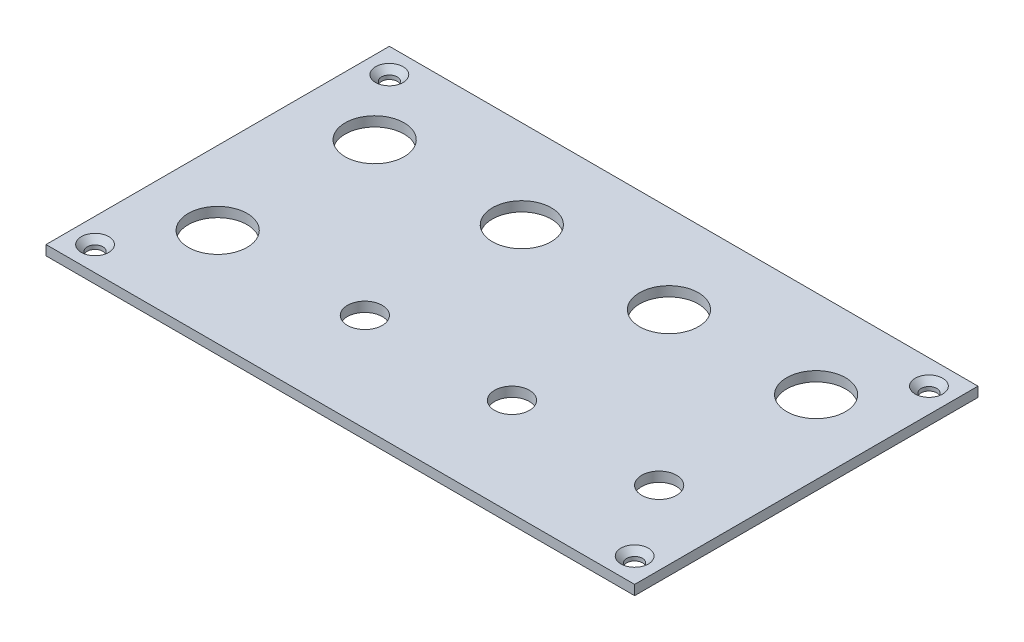
ISO-10303-21;
HEADER;
FILE_DESCRIPTION(('STEP AP214'),'2;1');
FILE_NAME('part.step','',(''),(''),'','','');
FILE_SCHEMA(('AUTOMOTIVE_DESIGN { 1 0 10303 214 1 1 1 1 }'));
ENDSEC;
DATA;
#1=APPLICATION_CONTEXT('core data for automotive mechanical design processes');
#2=APPLICATION_PROTOCOL_DEFINITION('international standard','automotive_design',2000,#1);
#3=PRODUCT_CONTEXT('',#1,'mechanical');
#4=PRODUCT('Part','Part','',(#3));
#5=PRODUCT_RELATED_PRODUCT_CATEGORY('part','',(#4));
#6=PRODUCT_DEFINITION_FORMATION('','',#4);
#7=PRODUCT_DEFINITION_CONTEXT('part definition',#1,'design');
#8=PRODUCT_DEFINITION('design','',#6,#7);
#9=PRODUCT_DEFINITION_SHAPE('','',#8);
#10=(LENGTH_UNIT() NAMED_UNIT(*) SI_UNIT(.MILLI.,.METRE.));
#11=(NAMED_UNIT(*) PLANE_ANGLE_UNIT() SI_UNIT($,.RADIAN.));
#12=(NAMED_UNIT(*) SI_UNIT($,.STERADIAN.) SOLID_ANGLE_UNIT());
#13=UNCERTAINTY_MEASURE_WITH_UNIT(LENGTH_MEASURE(1.E-05),#10,'distance_accuracy_value','');
#14=(GEOMETRIC_REPRESENTATION_CONTEXT(3) GLOBAL_UNCERTAINTY_ASSIGNED_CONTEXT((#13)) GLOBAL_UNIT_ASSIGNED_CONTEXT((#10,
#11,#12)) REPRESENTATION_CONTEXT('',''));
#15=CARTESIAN_POINT('',(0.,0.,0.));
#16=DIRECTION('',(0.,0.,1.));
#17=DIRECTION('',(1.,0.,0.));
#18=AXIS2_PLACEMENT_3D('',#15,#16,#17);
#19=CARTESIAN_POINT('',(0.,2.,0.));
#20=DIRECTION('',(-1.,0.,0.));
#21=DIRECTION('',(0.,0.,1.));
#22=AXIS2_PLACEMENT_3D('',#19,#20,#21);
#23=PLANE('',#22);
#24=DIRECTION('',(0.,0.,-1.));
#25=VECTOR('',#24,1.);
#26=CARTESIAN_POINT('',(0.,0.,0.));
#27=LINE('',#26,#25);
#28=CARTESIAN_POINT('',(0.,0.,0.));
#29=VERTEX_POINT('',#28);
#30=CARTESIAN_POINT('',(0.,0.,-70.));
#31=VERTEX_POINT('',#30);
#32=EDGE_CURVE('E99',#29,#31,#27,.T.);
#33=ORIENTED_EDGE('',*,*,#32,.T.);
#34=DIRECTION('',(0.,-1.,0.));
#35=VECTOR('',#34,1.);
#36=CARTESIAN_POINT('',(0.,2.,-70.));
#37=LINE('',#36,#35);
#38=CARTESIAN_POINT('',(0.,2.,-70.));
#39=VERTEX_POINT('',#38);
#40=EDGE_CURVE('E11',#39,#31,#37,.T.);
#41=ORIENTED_EDGE('',*,*,#40,.F.);
#42=DIRECTION('',(0.,0.,-1.));
#43=VECTOR('',#42,1.);
#44=CARTESIAN_POINT('',(0.,2.,0.));
#45=LINE('',#44,#43);
#46=CARTESIAN_POINT('',(0.,2.,0.));
#47=VERTEX_POINT('',#46);
#48=EDGE_CURVE('E86',#47,#39,#45,.T.);
#49=ORIENTED_EDGE('',*,*,#48,.F.);
#50=DIRECTION('',(0.,-1.,0.));
#51=VECTOR('',#50,1.);
#52=CARTESIAN_POINT('',(0.,2.,0.));
#53=LINE('',#52,#51);
#54=EDGE_CURVE('E95',#47,#29,#53,.T.);
#55=ORIENTED_EDGE('',*,*,#54,.T.);
#56=EDGE_LOOP('',(#33,#41,#49,#55));
#57=FACE_BOUND('',#56,.T.);
#58=ADVANCED_FACE('F33',(#57),#23,.F.);
#59=CARTESIAN_POINT('',(0.,2.,-70.));
#60=DIRECTION('',(0.,0.,1.));
#61=DIRECTION('',(1.,0.,0.));
#62=AXIS2_PLACEMENT_3D('',#59,#60,#61);
#63=PLANE('',#62);
#64=DIRECTION('',(-1.,0.,0.));
#65=VECTOR('',#64,1.);
#66=CARTESIAN_POINT('',(0.,0.,-70.));
#67=LINE('',#66,#65);
#68=CARTESIAN_POINT('',(-120.,0.,-70.));
#69=VERTEX_POINT('',#68);
#70=EDGE_CURVE('E90',#31,#69,#67,.T.);
#71=ORIENTED_EDGE('',*,*,#70,.T.);
#72=DIRECTION('',(0.,-1.,0.));
#73=VECTOR('',#72,1.);
#74=CARTESIAN_POINT('',(-120.,2.,-70.));
#75=LINE('',#74,#73);
#76=CARTESIAN_POINT('',(-120.,2.,-70.));
#77=VERTEX_POINT('',#76);
#78=EDGE_CURVE('E42',#77,#69,#75,.T.);
#79=ORIENTED_EDGE('',*,*,#78,.F.);
#80=DIRECTION('',(-1.,0.,0.));
#81=VECTOR('',#80,1.);
#82=CARTESIAN_POINT('',(0.,2.,-70.));
#83=LINE('',#82,#81);
#84=EDGE_CURVE('E81',#39,#77,#83,.T.);
#85=ORIENTED_EDGE('',*,*,#84,.F.);
#86=ORIENTED_EDGE('',*,*,#40,.T.);
#87=EDGE_LOOP('',(#71,#79,#85,#86));
#88=FACE_BOUND('',#87,.T.);
#89=ADVANCED_FACE('F89',(#88),#63,.F.);
#90=CARTESIAN_POINT('',(-120.,2.,0.));
#91=DIRECTION('',(1.,0.,0.));
#92=DIRECTION('',(0.,0.,-1.));
#93=AXIS2_PLACEMENT_3D('',#90,#91,#92);
#94=PLANE('',#93);
#95=DIRECTION('',(0.,0.,1.));
#96=VECTOR('',#95,1.);
#97=CARTESIAN_POINT('',(-120.,0.,0.));
#98=LINE('',#97,#96);
#99=CARTESIAN_POINT('',(-120.,0.,0.));
#100=VERTEX_POINT('',#99);
#101=EDGE_CURVE('E68',#69,#100,#98,.T.);
#102=ORIENTED_EDGE('',*,*,#101,.T.);
#103=DIRECTION('',(0.,-1.,0.));
#104=VECTOR('',#103,1.);
#105=CARTESIAN_POINT('',(-120.,2.,0.));
#106=LINE('',#105,#104);
#107=CARTESIAN_POINT('',(-120.,2.,0.));
#108=VERTEX_POINT('',#107);
#109=EDGE_CURVE('E91',#108,#100,#106,.T.);
#110=ORIENTED_EDGE('',*,*,#109,.F.);
#111=DIRECTION('',(0.,0.,1.));
#112=VECTOR('',#111,1.);
#113=CARTESIAN_POINT('',(-120.,2.,0.));
#114=LINE('',#113,#112);
#115=EDGE_CURVE('E84',#77,#108,#114,.T.);
#116=ORIENTED_EDGE('',*,*,#115,.F.);
#117=ORIENTED_EDGE('',*,*,#78,.T.);
#118=EDGE_LOOP('',(#102,#110,#116,#117));
#119=FACE_BOUND('',#118,.T.);
#120=ADVANCED_FACE('F93',(#119),#94,.F.);
#121=CARTESIAN_POINT('',(0.,2.,0.));
#122=DIRECTION('',(0.,0.,-1.));
#123=DIRECTION('',(-1.,0.,0.));
#124=AXIS2_PLACEMENT_3D('',#121,#122,#123);
#125=PLANE('',#124);
#126=DIRECTION('',(1.,0.,0.));
#127=VECTOR('',#126,1.);
#128=CARTESIAN_POINT('',(0.,0.,0.));
#129=LINE('',#128,#127);
#130=EDGE_CURVE('E74',#100,#29,#129,.T.);
#131=ORIENTED_EDGE('',*,*,#130,.T.);
#132=ORIENTED_EDGE('',*,*,#54,.F.);
#133=DIRECTION('',(1.,0.,0.));
#134=VECTOR('',#133,1.);
#135=CARTESIAN_POINT('',(0.,2.,0.));
#136=LINE('',#135,#134);
#137=EDGE_CURVE('E51',#108,#47,#136,.T.);
#138=ORIENTED_EDGE('',*,*,#137,.F.);
#139=ORIENTED_EDGE('',*,*,#109,.T.);
#140=EDGE_LOOP('',(#131,#132,#138,#139));
#141=FACE_BOUND('',#140,.T.);
#142=ADVANCED_FACE('F196',(#141),#125,.F.);
#143=CARTESIAN_POINT('',(0.,2.,0.));
#144=DIRECTION('',(0.,1.,0.));
#145=DIRECTION('',(0.,0.,1.));
#146=AXIS2_PLACEMENT_3D('',#143,#144,#145);
#147=PLANE('',#146);
#148=CARTESIAN_POINT('',(-115.,2.,-4.99999999999999));
#149=DIRECTION('',(0.,1.,0.));
#150=DIRECTION('',(0.,0.,1.));
#151=AXIS2_PLACEMENT_3D('',#148,#149,#150);
#152=CIRCLE('',#151,2.79999999999999);
#153=CARTESIAN_POINT('',(-115.,2.,-2.2));
#154=VERTEX_POINT('',#153);
#155=EDGE_CURVE('E128',#154,#154,#152,.T.);
#156=ORIENTED_EDGE('',*,*,#155,.F.);
#157=EDGE_LOOP('',(#156));
#158=FACE_BOUND('',#157,.T.);
#159=CARTESIAN_POINT('',(-5.,2.,-4.99999999999999));
#160=DIRECTION('',(0.,1.,0.));
#161=DIRECTION('',(0.,0.,1.));
#162=AXIS2_PLACEMENT_3D('',#159,#160,#161);
#163=CIRCLE('',#162,2.8);
#164=CARTESIAN_POINT('',(-5.,2.,-2.19999999999999));
#165=VERTEX_POINT('',#164);
#166=EDGE_CURVE('E118',#165,#165,#163,.T.);
#167=ORIENTED_EDGE('',*,*,#166,.F.);
#168=EDGE_LOOP('',(#167));
#169=FACE_BOUND('',#168,.T.);
#170=CARTESIAN_POINT('',(-5.,2.,-65.));
#171=DIRECTION('',(0.,1.,0.));
#172=DIRECTION('',(0.,0.,1.));
#173=AXIS2_PLACEMENT_3D('',#170,#171,#172);
#174=CIRCLE('',#173,2.8);
#175=CARTESIAN_POINT('',(-5.,2.,-62.2));
#176=VERTEX_POINT('',#175);
#177=EDGE_CURVE('E115',#176,#176,#174,.T.);
#178=ORIENTED_EDGE('',*,*,#177,.F.);
#179=EDGE_LOOP('',(#178));
#180=FACE_BOUND('',#179,.T.);
#181=CARTESIAN_POINT('',(-115.,2.,-65.));
#182=DIRECTION('',(0.,1.,0.));
#183=DIRECTION('',(0.,0.,1.));
#184=AXIS2_PLACEMENT_3D('',#181,#182,#183);
#185=CIRCLE('',#184,2.79999999999999);
#186=CARTESIAN_POINT('',(-115.,2.,-62.2));
#187=VERTEX_POINT('',#186);
#188=EDGE_CURVE('E112',#187,#187,#185,.T.);
#189=ORIENTED_EDGE('',*,*,#188,.F.);
#190=EDGE_LOOP('',(#189));
#191=FACE_BOUND('',#190,.T.);
#192=CARTESIAN_POINT('',(-105.,2.,-20.));
#193=DIRECTION('',(0.,1.,0.));
#194=DIRECTION('',(0.,0.,1.));
#195=AXIS2_PLACEMENT_3D('',#192,#193,#194);
#196=CIRCLE('',#195,6.);
#197=CARTESIAN_POINT('',(-105.,2.,-14.));
#198=VERTEX_POINT('',#197);
#199=EDGE_CURVE('E144',#198,#198,#196,.T.);
#200=ORIENTED_EDGE('',*,*,#199,.F.);
#201=EDGE_LOOP('',(#200));
#202=FACE_BOUND('',#201,.T.);
#203=CARTESIAN_POINT('',(-15.,2.,-20.));
#204=DIRECTION('',(0.,1.,0.));
#205=DIRECTION('',(0.,0.,1.));
#206=AXIS2_PLACEMENT_3D('',#203,#204,#205);
#207=CIRCLE('',#206,3.55);
#208=CARTESIAN_POINT('',(-15.,2.,-16.45));
#209=VERTEX_POINT('',#208);
#210=EDGE_CURVE('E148',#209,#209,#207,.T.);
#211=ORIENTED_EDGE('',*,*,#210,.F.);
#212=EDGE_LOOP('',(#211));
#213=FACE_BOUND('',#212,.T.);
#214=CARTESIAN_POINT('',(-45.,2.,-20.));
#215=DIRECTION('',(0.,1.,0.));
#216=DIRECTION('',(0.,0.,1.));
#217=AXIS2_PLACEMENT_3D('',#214,#215,#216);
#218=CIRCLE('',#217,3.55);
#219=CARTESIAN_POINT('',(-45.,2.,-16.45));
#220=VERTEX_POINT('',#219);
#221=EDGE_CURVE('E154',#220,#220,#218,.T.);
#222=ORIENTED_EDGE('',*,*,#221,.F.);
#223=EDGE_LOOP('',(#222));
#224=FACE_BOUND('',#223,.T.);
#225=CARTESIAN_POINT('',(-75.,2.,-20.));
#226=DIRECTION('',(0.,1.,0.));
#227=DIRECTION('',(0.,0.,1.));
#228=AXIS2_PLACEMENT_3D('',#225,#226,#227);
#229=CIRCLE('',#228,3.55);
#230=CARTESIAN_POINT('',(-75.,2.,-16.45));
#231=VERTEX_POINT('',#230);
#232=EDGE_CURVE('E160',#231,#231,#229,.T.);
#233=ORIENTED_EDGE('',*,*,#232,.F.);
#234=EDGE_LOOP('',(#233));
#235=FACE_BOUND('',#234,.T.);
#236=CARTESIAN_POINT('',(-15.,2.,-52.));
#237=DIRECTION('',(0.,1.,0.));
#238=DIRECTION('',(0.,0.,1.));
#239=AXIS2_PLACEMENT_3D('',#236,#237,#238);
#240=CIRCLE('',#239,6.00000000000001);
#241=CARTESIAN_POINT('',(-15.,2.,-46.));
#242=VERTEX_POINT('',#241);
#243=EDGE_CURVE('E166',#242,#242,#240,.T.);
#244=ORIENTED_EDGE('',*,*,#243,.F.);
#245=EDGE_LOOP('',(#244));
#246=FACE_BOUND('',#245,.T.);
#247=CARTESIAN_POINT('',(-45.,2.,-52.));
#248=DIRECTION('',(0.,1.,0.));
#249=DIRECTION('',(0.,0.,1.));
#250=AXIS2_PLACEMENT_3D('',#247,#248,#249);
#251=CIRCLE('',#250,6.);
#252=CARTESIAN_POINT('',(-45.,2.,-46.));
#253=VERTEX_POINT('',#252);
#254=EDGE_CURVE('E172',#253,#253,#251,.T.);
#255=ORIENTED_EDGE('',*,*,#254,.F.);
#256=EDGE_LOOP('',(#255));
#257=FACE_BOUND('',#256,.T.);
#258=CARTESIAN_POINT('',(-75.,2.,-52.));
#259=DIRECTION('',(0.,1.,0.));
#260=DIRECTION('',(0.,0.,1.));
#261=AXIS2_PLACEMENT_3D('',#258,#259,#260);
#262=CIRCLE('',#261,6.);
#263=CARTESIAN_POINT('',(-75.,2.,-46.));
#264=VERTEX_POINT('',#263);
#265=EDGE_CURVE('E178',#264,#264,#262,.T.);
#266=ORIENTED_EDGE('',*,*,#265,.F.);
#267=EDGE_LOOP('',(#266));
#268=FACE_BOUND('',#267,.T.);
#269=CARTESIAN_POINT('',(-105.,2.,-52.));
#270=DIRECTION('',(0.,1.,0.));
#271=DIRECTION('',(0.,0.,1.));
#272=AXIS2_PLACEMENT_3D('',#269,#270,#271);
#273=CIRCLE('',#272,6.);
#274=CARTESIAN_POINT('',(-105.,2.,-46.));
#275=VERTEX_POINT('',#274);
#276=EDGE_CURVE('E184',#275,#275,#273,.T.);
#277=ORIENTED_EDGE('',*,*,#276,.F.);
#278=EDGE_LOOP('',(#277));
#279=FACE_BOUND('',#278,.T.);
#280=ORIENTED_EDGE('',*,*,#48,.T.);
#281=ORIENTED_EDGE('',*,*,#84,.T.);
#282=ORIENTED_EDGE('',*,*,#115,.T.);
#283=ORIENTED_EDGE('',*,*,#137,.T.);
#284=EDGE_LOOP('',(#280,#281,#282,#283));
#285=FACE_BOUND('',#284,.T.);
#286=ADVANCED_FACE('F82',(#158,#169,#180,#191,#202,#213,#224,#235,#246,#257,#268,#279,#285),
#147,.T.);
#287=CARTESIAN_POINT('',(0.,0.,0.));
#288=DIRECTION('',(0.,1.,0.));
#289=DIRECTION('',(0.,0.,1.));
#290=AXIS2_PLACEMENT_3D('',#287,#288,#289);
#291=PLANE('',#290);
#292=CARTESIAN_POINT('',(-115.,0.,-4.99999999999999));
#293=DIRECTION('',(0.,1.,0.));
#294=DIRECTION('',(0.,0.,1.));
#295=AXIS2_PLACEMENT_3D('',#292,#293,#294);
#296=CIRCLE('',#295,1.60000000000001);
#297=CARTESIAN_POINT('',(-115.,0.,-3.39999999999998));
#298=VERTEX_POINT('',#297);
#299=EDGE_CURVE('E111',#298,#298,#296,.T.);
#300=ORIENTED_EDGE('',*,*,#299,.T.);
#301=EDGE_LOOP('',(#300));
#302=FACE_BOUND('',#301,.T.);
#303=CARTESIAN_POINT('',(-5.,0.,-4.99999999999999));
#304=DIRECTION('',(0.,1.,0.));
#305=DIRECTION('',(0.,0.,1.));
#306=AXIS2_PLACEMENT_3D('',#303,#304,#305);
#307=CIRCLE('',#306,1.6);
#308=CARTESIAN_POINT('',(-5.,0.,-3.39999999999999));
#309=VERTEX_POINT('',#308);
#310=EDGE_CURVE('E135',#309,#309,#307,.T.);
#311=ORIENTED_EDGE('',*,*,#310,.T.);
#312=EDGE_LOOP('',(#311));
#313=FACE_BOUND('',#312,.T.);
#314=CARTESIAN_POINT('',(-5.,0.,-65.));
#315=DIRECTION('',(0.,1.,0.));
#316=DIRECTION('',(0.,0.,1.));
#317=AXIS2_PLACEMENT_3D('',#314,#315,#316);
#318=CIRCLE('',#317,1.60000000000001);
#319=CARTESIAN_POINT('',(-5.,0.,-63.4));
#320=VERTEX_POINT('',#319);
#321=EDGE_CURVE('E138',#320,#320,#318,.T.);
#322=ORIENTED_EDGE('',*,*,#321,.T.);
#323=EDGE_LOOP('',(#322));
#324=FACE_BOUND('',#323,.T.);
#325=CARTESIAN_POINT('',(-115.,0.,-65.));
#326=DIRECTION('',(0.,1.,0.));
#327=DIRECTION('',(0.,0.,1.));
#328=AXIS2_PLACEMENT_3D('',#325,#326,#327);
#329=CIRCLE('',#328,1.60000000000001);
#330=CARTESIAN_POINT('',(-115.,0.,-63.4));
#331=VERTEX_POINT('',#330);
#332=EDGE_CURVE('E141',#331,#331,#329,.T.);
#333=ORIENTED_EDGE('',*,*,#332,.T.);
#334=EDGE_LOOP('',(#333));
#335=FACE_BOUND('',#334,.T.);
#336=CARTESIAN_POINT('',(-105.,0.,-20.));
#337=DIRECTION('',(0.,1.,0.));
#338=DIRECTION('',(0.,0.,1.));
#339=AXIS2_PLACEMENT_3D('',#336,#337,#338);
#340=CIRCLE('',#339,6.);
#341=CARTESIAN_POINT('',(-105.,0.,-14.));
#342=VERTEX_POINT('',#341);
#343=EDGE_CURVE('E145',#342,#342,#340,.T.);
#344=ORIENTED_EDGE('',*,*,#343,.T.);
#345=EDGE_LOOP('',(#344));
#346=FACE_BOUND('',#345,.T.);
#347=CARTESIAN_POINT('',(-15.,0.,-20.));
#348=DIRECTION('',(0.,1.,0.));
#349=DIRECTION('',(0.,0.,1.));
#350=AXIS2_PLACEMENT_3D('',#347,#348,#349);
#351=CIRCLE('',#350,3.55);
#352=CARTESIAN_POINT('',(-15.,0.,-16.45));
#353=VERTEX_POINT('',#352);
#354=EDGE_CURVE('E151',#353,#353,#351,.T.);
#355=ORIENTED_EDGE('',*,*,#354,.T.);
#356=EDGE_LOOP('',(#355));
#357=FACE_BOUND('',#356,.T.);
#358=CARTESIAN_POINT('',(-45.,0.,-20.));
#359=DIRECTION('',(0.,1.,0.));
#360=DIRECTION('',(0.,0.,1.));
#361=AXIS2_PLACEMENT_3D('',#358,#359,#360);
#362=CIRCLE('',#361,3.55);
#363=CARTESIAN_POINT('',(-45.,0.,-16.45));
#364=VERTEX_POINT('',#363);
#365=EDGE_CURVE('E157',#364,#364,#362,.T.);
#366=ORIENTED_EDGE('',*,*,#365,.T.);
#367=EDGE_LOOP('',(#366));
#368=FACE_BOUND('',#367,.T.);
#369=CARTESIAN_POINT('',(-75.,0.,-20.));
#370=DIRECTION('',(0.,1.,0.));
#371=DIRECTION('',(0.,0.,1.));
#372=AXIS2_PLACEMENT_3D('',#369,#370,#371);
#373=CIRCLE('',#372,3.55);
#374=CARTESIAN_POINT('',(-75.,0.,-16.45));
#375=VERTEX_POINT('',#374);
#376=EDGE_CURVE('E163',#375,#375,#373,.T.);
#377=ORIENTED_EDGE('',*,*,#376,.T.);
#378=EDGE_LOOP('',(#377));
#379=FACE_BOUND('',#378,.T.);
#380=CARTESIAN_POINT('',(-15.,0.,-52.));
#381=DIRECTION('',(0.,1.,0.));
#382=DIRECTION('',(0.,0.,1.));
#383=AXIS2_PLACEMENT_3D('',#380,#381,#382);
#384=CIRCLE('',#383,6.00000000000001);
#385=CARTESIAN_POINT('',(-15.,0.,-46.));
#386=VERTEX_POINT('',#385);
#387=EDGE_CURVE('E169',#386,#386,#384,.T.);
#388=ORIENTED_EDGE('',*,*,#387,.T.);
#389=EDGE_LOOP('',(#388));
#390=FACE_BOUND('',#389,.T.);
#391=CARTESIAN_POINT('',(-45.,0.,-52.));
#392=DIRECTION('',(0.,1.,0.));
#393=DIRECTION('',(0.,0.,1.));
#394=AXIS2_PLACEMENT_3D('',#391,#392,#393);
#395=CIRCLE('',#394,6.);
#396=CARTESIAN_POINT('',(-45.,0.,-46.));
#397=VERTEX_POINT('',#396);
#398=EDGE_CURVE('E175',#397,#397,#395,.T.);
#399=ORIENTED_EDGE('',*,*,#398,.T.);
#400=EDGE_LOOP('',(#399));
#401=FACE_BOUND('',#400,.T.);
#402=CARTESIAN_POINT('',(-75.,0.,-52.));
#403=DIRECTION('',(0.,1.,0.));
#404=DIRECTION('',(0.,0.,1.));
#405=AXIS2_PLACEMENT_3D('',#402,#403,#404);
#406=CIRCLE('',#405,6.);
#407=CARTESIAN_POINT('',(-75.,0.,-46.));
#408=VERTEX_POINT('',#407);
#409=EDGE_CURVE('E181',#408,#408,#406,.T.);
#410=ORIENTED_EDGE('',*,*,#409,.T.);
#411=EDGE_LOOP('',(#410));
#412=FACE_BOUND('',#411,.T.);
#413=CARTESIAN_POINT('',(-105.,0.,-52.));
#414=DIRECTION('',(0.,1.,0.));
#415=DIRECTION('',(0.,0.,1.));
#416=AXIS2_PLACEMENT_3D('',#413,#414,#415);
#417=CIRCLE('',#416,6.);
#418=CARTESIAN_POINT('',(-105.,0.,-46.));
#419=VERTEX_POINT('',#418);
#420=EDGE_CURVE('E102',#419,#419,#417,.T.);
#421=ORIENTED_EDGE('',*,*,#420,.T.);
#422=EDGE_LOOP('',(#421));
#423=FACE_BOUND('',#422,.T.);
#424=ORIENTED_EDGE('',*,*,#32,.F.);
#425=ORIENTED_EDGE('',*,*,#130,.F.);
#426=ORIENTED_EDGE('',*,*,#101,.F.);
#427=ORIENTED_EDGE('',*,*,#70,.F.);
#428=EDGE_LOOP('',(#424,#425,#426,#427));
#429=FACE_BOUND('',#428,.T.);
#430=ADVANCED_FACE('F195',(#302,#313,#324,#335,#346,#357,#368,#379,#390,#401,#412,#423,#429),
#291,.F.);
#431=CARTESIAN_POINT('',(-105.,0.,-52.));
#432=DIRECTION('',(0.,1.,0.));
#433=DIRECTION('',(0.,0.,1.));
#434=AXIS2_PLACEMENT_3D('',#431,#432,#433);
#435=CYLINDRICAL_SURFACE('',#434,6.);
#436=ORIENTED_EDGE('',*,*,#420,.F.);
#437=EDGE_LOOP('',(#436));
#438=FACE_BOUND('',#437,.T.);
#439=ORIENTED_EDGE('',*,*,#276,.T.);
#440=EDGE_LOOP('',(#439));
#441=FACE_BOUND('',#440,.T.);
#442=ADVANCED_FACE('F192',(#438,#441),#435,.F.);
#443=CARTESIAN_POINT('',(-75.,0.,-52.));
#444=DIRECTION('',(0.,1.,0.));
#445=DIRECTION('',(0.,0.,1.));
#446=AXIS2_PLACEMENT_3D('',#443,#444,#445);
#447=CYLINDRICAL_SURFACE('',#446,6.);
#448=ORIENTED_EDGE('',*,*,#409,.F.);
#449=EDGE_LOOP('',(#448));
#450=FACE_BOUND('',#449,.T.);
#451=ORIENTED_EDGE('',*,*,#265,.T.);
#452=EDGE_LOOP('',(#451));
#453=FACE_BOUND('',#452,.T.);
#454=ADVANCED_FACE('F236',(#450,#453),#447,.F.);
#455=CARTESIAN_POINT('',(-45.,0.,-52.));
#456=DIRECTION('',(0.,1.,0.));
#457=DIRECTION('',(0.,0.,1.));
#458=AXIS2_PLACEMENT_3D('',#455,#456,#457);
#459=CYLINDRICAL_SURFACE('',#458,6.);
#460=ORIENTED_EDGE('',*,*,#398,.F.);
#461=EDGE_LOOP('',(#460));
#462=FACE_BOUND('',#461,.T.);
#463=ORIENTED_EDGE('',*,*,#254,.T.);
#464=EDGE_LOOP('',(#463));
#465=FACE_BOUND('',#464,.T.);
#466=ADVANCED_FACE('F246',(#462,#465),#459,.F.);
#467=CARTESIAN_POINT('',(-15.,0.,-52.));
#468=DIRECTION('',(0.,1.,0.));
#469=DIRECTION('',(0.,0.,1.));
#470=AXIS2_PLACEMENT_3D('',#467,#468,#469);
#471=CYLINDRICAL_SURFACE('',#470,6.00000000000001);
#472=ORIENTED_EDGE('',*,*,#387,.F.);
#473=EDGE_LOOP('',(#472));
#474=FACE_BOUND('',#473,.T.);
#475=ORIENTED_EDGE('',*,*,#243,.T.);
#476=EDGE_LOOP('',(#475));
#477=FACE_BOUND('',#476,.T.);
#478=ADVANCED_FACE('F256',(#474,#477),#471,.F.);
#479=CARTESIAN_POINT('',(-75.,0.,-20.));
#480=DIRECTION('',(0.,1.,0.));
#481=DIRECTION('',(0.,0.,1.));
#482=AXIS2_PLACEMENT_3D('',#479,#480,#481);
#483=CYLINDRICAL_SURFACE('',#482,3.55);
#484=ORIENTED_EDGE('',*,*,#376,.F.);
#485=EDGE_LOOP('',(#484));
#486=FACE_BOUND('',#485,.T.);
#487=ORIENTED_EDGE('',*,*,#232,.T.);
#488=EDGE_LOOP('',(#487));
#489=FACE_BOUND('',#488,.T.);
#490=ADVANCED_FACE('F266',(#486,#489),#483,.F.);
#491=CARTESIAN_POINT('',(-45.,0.,-20.));
#492=DIRECTION('',(0.,1.,0.));
#493=DIRECTION('',(0.,0.,1.));
#494=AXIS2_PLACEMENT_3D('',#491,#492,#493);
#495=CYLINDRICAL_SURFACE('',#494,3.55);
#496=ORIENTED_EDGE('',*,*,#365,.F.);
#497=EDGE_LOOP('',(#496));
#498=FACE_BOUND('',#497,.T.);
#499=ORIENTED_EDGE('',*,*,#221,.T.);
#500=EDGE_LOOP('',(#499));
#501=FACE_BOUND('',#500,.T.);
#502=ADVANCED_FACE('F276',(#498,#501),#495,.F.);
#503=CARTESIAN_POINT('',(-15.,0.,-20.));
#504=DIRECTION('',(0.,1.,0.));
#505=DIRECTION('',(0.,0.,1.));
#506=AXIS2_PLACEMENT_3D('',#503,#504,#505);
#507=CYLINDRICAL_SURFACE('',#506,3.55);
#508=ORIENTED_EDGE('',*,*,#354,.F.);
#509=EDGE_LOOP('',(#508));
#510=FACE_BOUND('',#509,.T.);
#511=ORIENTED_EDGE('',*,*,#210,.T.);
#512=EDGE_LOOP('',(#511));
#513=FACE_BOUND('',#512,.T.);
#514=ADVANCED_FACE('F286',(#510,#513),#507,.F.);
#515=CARTESIAN_POINT('',(-105.,0.,-20.));
#516=DIRECTION('',(0.,1.,0.));
#517=DIRECTION('',(0.,0.,1.));
#518=AXIS2_PLACEMENT_3D('',#515,#516,#517);
#519=CYLINDRICAL_SURFACE('',#518,6.);
#520=ORIENTED_EDGE('',*,*,#343,.F.);
#521=EDGE_LOOP('',(#520));
#522=FACE_BOUND('',#521,.T.);
#523=ORIENTED_EDGE('',*,*,#199,.T.);
#524=EDGE_LOOP('',(#523));
#525=FACE_BOUND('',#524,.T.);
#526=ADVANCED_FACE('F296',(#522,#525),#519,.F.);
#527=CARTESIAN_POINT('',(-115.,0.,-65.));
#528=DIRECTION('',(0.,1.,0.));
#529=DIRECTION('',(0.,0.,1.));
#530=AXIS2_PLACEMENT_3D('',#527,#528,#529);
#531=CYLINDRICAL_SURFACE('',#530,1.60000000000001);
#532=CARTESIAN_POINT('',(-115.,0.800000000000019,-65.));
#533=DIRECTION('',(0.,1.,0.));
#534=DIRECTION('',(0.,0.,1.));
#535=AXIS2_PLACEMENT_3D('',#532,#533,#534);
#536=CIRCLE('',#535,1.60000000000001);
#537=CARTESIAN_POINT('',(-115.,0.800000000000019,-63.4));
#538=VERTEX_POINT('',#537);
#539=EDGE_CURVE('E108',#538,#538,#536,.T.);
#540=ORIENTED_EDGE('',*,*,#539,.T.);
#541=EDGE_LOOP('',(#540));
#542=FACE_BOUND('',#541,.T.);
#543=ORIENTED_EDGE('',*,*,#332,.F.);
#544=EDGE_LOOP('',(#543));
#545=FACE_BOUND('',#544,.T.);
#546=ADVANCED_FACE('F306',(#542,#545),#531,.F.);
#547=CARTESIAN_POINT('',(-5.,0.,-65.));
#548=DIRECTION('',(0.,1.,0.));
#549=DIRECTION('',(0.,0.,1.));
#550=AXIS2_PLACEMENT_3D('',#547,#548,#549);
#551=CYLINDRICAL_SURFACE('',#550,1.60000000000001);
#552=CARTESIAN_POINT('',(-5.,0.800000000000012,-65.));
#553=DIRECTION('',(0.,1.,0.));
#554=DIRECTION('',(0.,0.,1.));
#555=AXIS2_PLACEMENT_3D('',#552,#553,#554);
#556=CIRCLE('',#555,1.60000000000001);
#557=CARTESIAN_POINT('',(-5.,0.800000000000012,-63.4));
#558=VERTEX_POINT('',#557);
#559=EDGE_CURVE('E113',#558,#558,#556,.T.);
#560=ORIENTED_EDGE('',*,*,#559,.T.);
#561=EDGE_LOOP('',(#560));
#562=FACE_BOUND('',#561,.T.);
#563=ORIENTED_EDGE('',*,*,#321,.F.);
#564=EDGE_LOOP('',(#563));
#565=FACE_BOUND('',#564,.T.);
#566=ADVANCED_FACE('F324',(#562,#565),#551,.F.);
#567=CARTESIAN_POINT('',(-5.,0.,-4.99999999999999));
#568=DIRECTION('',(0.,1.,0.));
#569=DIRECTION('',(0.,0.,1.));
#570=AXIS2_PLACEMENT_3D('',#567,#568,#569);
#571=CYLINDRICAL_SURFACE('',#570,1.6);
#572=CARTESIAN_POINT('',(-5.,0.800000000000004,-4.99999999999999));
#573=DIRECTION('',(0.,1.,0.));
#574=DIRECTION('',(0.,0.,1.));
#575=AXIS2_PLACEMENT_3D('',#572,#573,#574);
#576=CIRCLE('',#575,1.6);
#577=CARTESIAN_POINT('',(-5.,0.800000000000004,-3.39999999999999));
#578=VERTEX_POINT('',#577);
#579=EDGE_CURVE('E116',#578,#578,#576,.T.);
#580=ORIENTED_EDGE('',*,*,#579,.T.);
#581=EDGE_LOOP('',(#580));
#582=FACE_BOUND('',#581,.T.);
#583=ORIENTED_EDGE('',*,*,#310,.F.);
#584=EDGE_LOOP('',(#583));
#585=FACE_BOUND('',#584,.T.);
#586=ADVANCED_FACE('F334',(#582,#585),#571,.F.);
#587=CARTESIAN_POINT('',(-115.,0.,-4.99999999999999));
#588=DIRECTION('',(0.,1.,0.));
#589=DIRECTION('',(0.,0.,1.));
#590=AXIS2_PLACEMENT_3D('',#587,#588,#589);
#591=CYLINDRICAL_SURFACE('',#590,1.60000000000001);
#592=CARTESIAN_POINT('',(-115.,0.800000000000018,-4.99999999999999));
#593=DIRECTION('',(0.,1.,0.));
#594=DIRECTION('',(0.,0.,1.));
#595=AXIS2_PLACEMENT_3D('',#592,#593,#594);
#596=CIRCLE('',#595,1.60000000000001);
#597=CARTESIAN_POINT('',(-115.,0.800000000000018,-3.39999999999998));
#598=VERTEX_POINT('',#597);
#599=EDGE_CURVE('E36',#598,#598,#596,.T.);
#600=ORIENTED_EDGE('',*,*,#599,.T.);
#601=EDGE_LOOP('',(#600));
#602=FACE_BOUND('',#601,.T.);
#603=ORIENTED_EDGE('',*,*,#299,.F.);
#604=EDGE_LOOP('',(#603));
#605=FACE_BOUND('',#604,.T.);
#606=ADVANCED_FACE('F344',(#602,#605),#591,.F.);
#607=CARTESIAN_POINT('',(-115.,2.,-65.));
#608=DIRECTION('',(0.,1.,0.));
#609=DIRECTION('',(0.,0.,1.));
#610=AXIS2_PLACEMENT_3D('',#607,#608,#609);
#611=CONICAL_SURFACE('',#610,2.79999999999999,0.78539816339745);
#612=ORIENTED_EDGE('',*,*,#188,.T.);
#613=EDGE_LOOP('',(#612));
#614=FACE_BOUND('',#613,.T.);
#615=ORIENTED_EDGE('',*,*,#539,.F.);
#616=EDGE_LOOP('',(#615));
#617=FACE_BOUND('',#616,.T.);
#618=ADVANCED_FACE('F353',(#614,#617),#611,.F.);
#619=CARTESIAN_POINT('',(-5.,2.,-65.));
#620=DIRECTION('',(0.,1.,0.));
#621=DIRECTION('',(0.,0.,1.));
#622=AXIS2_PLACEMENT_3D('',#619,#620,#621);
#623=CONICAL_SURFACE('',#622,2.8,0.78539816339745);
#624=ORIENTED_EDGE('',*,*,#177,.T.);
#625=EDGE_LOOP('',(#624));
#626=FACE_BOUND('',#625,.T.);
#627=ORIENTED_EDGE('',*,*,#559,.F.);
#628=EDGE_LOOP('',(#627));
#629=FACE_BOUND('',#628,.T.);
#630=ADVANCED_FACE('F363',(#626,#629),#623,.F.);
#631=CARTESIAN_POINT('',(-5.,2.,-4.99999999999999));
#632=DIRECTION('',(0.,1.,0.));
#633=DIRECTION('',(0.,0.,1.));
#634=AXIS2_PLACEMENT_3D('',#631,#632,#633);
#635=CONICAL_SURFACE('',#634,2.8,0.78539816339745);
#636=ORIENTED_EDGE('',*,*,#166,.T.);
#637=EDGE_LOOP('',(#636));
#638=FACE_BOUND('',#637,.T.);
#639=ORIENTED_EDGE('',*,*,#579,.F.);
#640=EDGE_LOOP('',(#639));
#641=FACE_BOUND('',#640,.T.);
#642=ADVANCED_FACE('F373',(#638,#641),#635,.F.);
#643=CARTESIAN_POINT('',(-115.,2.,-4.99999999999999));
#644=DIRECTION('',(0.,1.,0.));
#645=DIRECTION('',(0.,0.,1.));
#646=AXIS2_PLACEMENT_3D('',#643,#644,#645);
#647=CONICAL_SURFACE('',#646,2.79999999999999,0.78539816339745);
#648=ORIENTED_EDGE('',*,*,#155,.T.);
#649=EDGE_LOOP('',(#648));
#650=FACE_BOUND('',#649,.T.);
#651=ORIENTED_EDGE('',*,*,#599,.F.);
#652=EDGE_LOOP('',(#651));
#653=FACE_BOUND('',#652,.T.);
#654=ADVANCED_FACE('F383',(#650,#653),#647,.F.);
#655=CLOSED_SHELL('',(#58,#89,#120,#142,#286,#430,#442,#454,#466,#478,#490,#502,#514,#526,#546,
#566,#586,#606,#618,#630,#642,#654));
#656=MANIFOLD_SOLID_BREP('B2',#655);
#657=ADVANCED_BREP_SHAPE_REPRESENTATION('',(#18,#656),#14);
#658=SHAPE_DEFINITION_REPRESENTATION(#9,#657);
ENDSEC;
END-ISO-10303-21;
